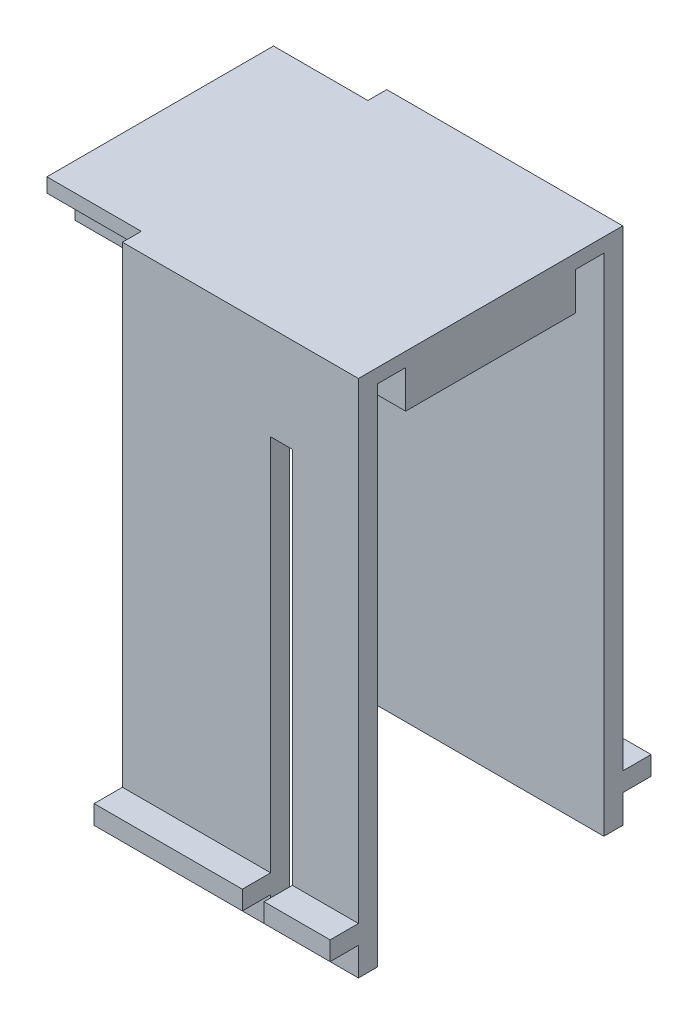
ISO-10303-21;
HEADER;
FILE_DESCRIPTION(('STEP AP214'),'2;1');
FILE_NAME('part.step','',(''),(''),'','','');
FILE_SCHEMA(('AUTOMOTIVE_DESIGN { 1 0 10303 214 1 1 1 1 }'));
ENDSEC;
DATA;
#1=APPLICATION_CONTEXT('core data for automotive mechanical design processes');
#2=APPLICATION_PROTOCOL_DEFINITION('international standard','automotive_design',2000,#1);
#3=PRODUCT_CONTEXT('',#1,'mechanical');
#4=PRODUCT('Part','Part','',(#3));
#5=PRODUCT_RELATED_PRODUCT_CATEGORY('part','',(#4));
#6=PRODUCT_DEFINITION_FORMATION('','',#4);
#7=PRODUCT_DEFINITION_CONTEXT('part definition',#1,'design');
#8=PRODUCT_DEFINITION('design','',#6,#7);
#9=PRODUCT_DEFINITION_SHAPE('','',#8);
#10=(LENGTH_UNIT() NAMED_UNIT(*) SI_UNIT(.MILLI.,.METRE.));
#11=(NAMED_UNIT(*) PLANE_ANGLE_UNIT() SI_UNIT($,.RADIAN.));
#12=(NAMED_UNIT(*) SI_UNIT($,.STERADIAN.) SOLID_ANGLE_UNIT());
#13=UNCERTAINTY_MEASURE_WITH_UNIT(LENGTH_MEASURE(1.E-05),#10,'distance_accuracy_value','');
#14=(GEOMETRIC_REPRESENTATION_CONTEXT(3) GLOBAL_UNCERTAINTY_ASSIGNED_CONTEXT((#13)) GLOBAL_UNIT_ASSIGNED_CONTEXT((#10,
#11,#12)) REPRESENTATION_CONTEXT('',''));
#15=CARTESIAN_POINT('',(0.,0.,0.));
#16=DIRECTION('',(0.,0.,1.));
#17=DIRECTION('',(1.,0.,0.));
#18=AXIS2_PLACEMENT_3D('',#15,#16,#17);
#19=CARTESIAN_POINT('',(0.,0.,-26.));
#20=DIRECTION('',(0.,0.,-1.));
#21=DIRECTION('',(-1.,0.,0.));
#22=AXIS2_PLACEMENT_3D('',#19,#20,#21);
#23=PLANE('',#22);
#24=DIRECTION('',(1.,0.,0.));
#25=VECTOR('',#24,1.);
#26=CARTESIAN_POINT('',(12.5,-22.5,-26.));
#27=LINE('',#26,#25);
#28=CARTESIAN_POINT('',(-12.5,-22.5,-26.));
#29=VERTEX_POINT('',#28);
#30=CARTESIAN_POINT('',(12.5,-22.5,-26.));
#31=VERTEX_POINT('',#30);
#32=EDGE_CURVE('E63',#29,#31,#27,.T.);
#33=ORIENTED_EDGE('',*,*,#32,.F.);
#34=DIRECTION('',(0.,1.,0.));
#35=VECTOR('',#34,1.);
#36=CARTESIAN_POINT('',(-12.5,27.5,-26.));
#37=LINE('',#36,#35);
#38=CARTESIAN_POINT('',(-12.5,27.5,-26.));
#39=VERTEX_POINT('',#38);
#40=EDGE_CURVE('E430',#29,#39,#37,.T.);
#41=ORIENTED_EDGE('',*,*,#40,.T.);
#42=DIRECTION('',(1.,0.,0.));
#43=VECTOR('',#42,1.);
#44=CARTESIAN_POINT('',(12.5,27.5,-26.));
#45=LINE('',#44,#43);
#46=CARTESIAN_POINT('',(12.5,27.5,-26.));
#47=VERTEX_POINT('',#46);
#48=EDGE_CURVE('E434',#39,#47,#45,.T.);
#49=ORIENTED_EDGE('',*,*,#48,.T.);
#50=DIRECTION('',(0.,-1.,0.));
#51=VECTOR('',#50,1.);
#52=CARTESIAN_POINT('',(12.5,27.5,-26.));
#53=LINE('',#52,#51);
#54=EDGE_CURVE('E424',#47,#31,#53,.T.);
#55=ORIENTED_EDGE('',*,*,#54,.T.);
#56=EDGE_LOOP('',(#33,#41,#49,#55));
#57=FACE_BOUND('',#56,.T.);
#58=ADVANCED_FACE('F45',(#57),#23,.T.);
#59=CARTESIAN_POINT('',(0.,0.,2.));
#60=DIRECTION('',(0.,0.,1.));
#61=DIRECTION('',(1.,0.,0.));
#62=AXIS2_PLACEMENT_3D('',#59,#60,#61);
#63=PLANE('',#62);
#64=DIRECTION('',(0.,1.,0.));
#65=VECTOR('',#64,1.);
#66=CARTESIAN_POINT('',(12.5,27.5,2.));
#67=LINE('',#66,#65);
#68=CARTESIAN_POINT('',(12.5,-27.5,2.));
#69=VERTEX_POINT('',#68);
#70=CARTESIAN_POINT('',(12.5,-24.5,2.));
#71=VERTEX_POINT('',#70);
#72=EDGE_CURVE('E495',#69,#71,#67,.T.);
#73=ORIENTED_EDGE('',*,*,#72,.T.);
#74=DIRECTION('',(1.,0.,0.));
#75=VECTOR('',#74,1.);
#76=CARTESIAN_POINT('',(5.50000000000001,-24.5,2.));
#77=LINE('',#76,#75);
#78=CARTESIAN_POINT('',(5.50000000000001,-24.5,2.));
#79=VERTEX_POINT('',#78);
#80=EDGE_CURVE('E301',#79,#71,#77,.T.);
#81=ORIENTED_EDGE('',*,*,#80,.F.);
#82=DIRECTION('',(0.,1.,0.));
#83=VECTOR('',#82,1.);
#84=CARTESIAN_POINT('',(5.50000000000001,-27.5,2.));
#85=LINE('',#84,#83);
#86=CARTESIAN_POINT('',(5.50000000000001,-27.5,2.));
#87=VERTEX_POINT('',#86);
#88=EDGE_CURVE('E362',#87,#79,#85,.T.);
#89=ORIENTED_EDGE('',*,*,#88,.F.);
#90=DIRECTION('',(1.,0.,0.));
#91=VECTOR('',#90,1.);
#92=CARTESIAN_POINT('',(-12.5,-27.5,2.));
#93=LINE('',#92,#91);
#94=EDGE_CURVE('E507',#87,#69,#93,.T.);
#95=ORIENTED_EDGE('',*,*,#94,.T.);
#96=EDGE_LOOP('',(#73,#81,#89,#95));
#97=FACE_BOUND('',#96,.T.);
#98=ADVANCED_FACE('F573',(#97),#63,.T.);
#99=CARTESIAN_POINT('',(5.50000000000001,-22.5,2.));
#100=VERTEX_POINT('',#99);
#101=CARTESIAN_POINT('',(5.50000000000001,17.5,2.));
#102=VERTEX_POINT('',#101);
#103=EDGE_CURVE('E353',#100,#102,#85,.T.);
#104=ORIENTED_EDGE('',*,*,#103,.F.);
#105=DIRECTION('',(-1.,0.,0.));
#106=VECTOR('',#105,1.);
#107=CARTESIAN_POINT('',(5.50000000000001,-22.5,2.));
#108=LINE('',#107,#106);
#109=CARTESIAN_POINT('',(12.5,-22.5,2.));
#110=VERTEX_POINT('',#109);
#111=EDGE_CURVE('E297',#110,#100,#108,.T.);
#112=ORIENTED_EDGE('',*,*,#111,.F.);
#113=CARTESIAN_POINT('',(12.5,27.5,2.));
#114=VERTEX_POINT('',#113);
#115=EDGE_CURVE('E500',#110,#114,#67,.T.);
#116=ORIENTED_EDGE('',*,*,#115,.T.);
#117=DIRECTION('',(-1.,0.,0.));
#118=VECTOR('',#117,1.);
#119=CARTESIAN_POINT('',(-12.5,27.5,2.));
#120=LINE('',#119,#118);
#121=CARTESIAN_POINT('',(-12.5,27.5,2.));
#122=VERTEX_POINT('',#121);
#123=EDGE_CURVE('E499',#114,#122,#120,.T.);
#124=ORIENTED_EDGE('',*,*,#123,.T.);
#125=DIRECTION('',(0.,-1.,0.));
#126=VECTOR('',#125,1.);
#127=CARTESIAN_POINT('',(-12.5,27.5,2.));
#128=LINE('',#127,#126);
#129=CARTESIAN_POINT('',(-12.5,-22.5,2.));
#130=VERTEX_POINT('',#129);
#131=EDGE_CURVE('E504',#122,#130,#128,.T.);
#132=ORIENTED_EDGE('',*,*,#131,.T.);
#133=DIRECTION('',(-1.,0.,0.));
#134=VECTOR('',#133,1.);
#135=CARTESIAN_POINT('',(-12.5,-22.5,2.));
#136=LINE('',#135,#134);
#137=CARTESIAN_POINT('',(3.20000000000001,-22.5,2.));
#138=VERTEX_POINT('',#137);
#139=EDGE_CURVE('E322',#138,#130,#136,.T.);
#140=ORIENTED_EDGE('',*,*,#139,.F.);
#141=DIRECTION('',(0.,-1.,0.));
#142=VECTOR('',#141,1.);
#143=CARTESIAN_POINT('',(3.20000000000001,-27.5,2.));
#144=LINE('',#143,#142);
#145=CARTESIAN_POINT('',(3.20000000000001,17.5,2.));
#146=VERTEX_POINT('',#145);
#147=EDGE_CURVE('E371',#146,#138,#144,.T.);
#148=ORIENTED_EDGE('',*,*,#147,.F.);
#149=DIRECTION('',(-1.,0.,0.));
#150=VECTOR('',#149,1.);
#151=CARTESIAN_POINT('',(5.50000000000001,17.5,2.));
#152=LINE('',#151,#150);
#153=EDGE_CURVE('E366',#102,#146,#152,.T.);
#154=ORIENTED_EDGE('',*,*,#153,.F.);
#155=EDGE_LOOP('',(#104,#112,#116,#124,#132,#140,#148,#154));
#156=FACE_BOUND('',#155,.T.);
#157=ADVANCED_FACE('F581',(#156),#63,.T.);
#158=CARTESIAN_POINT('',(-12.5,-27.5,2.));
#159=DIRECTION('',(0.,1.,0.));
#160=DIRECTION('',(0.,0.,1.));
#161=AXIS2_PLACEMENT_3D('',#158,#159,#160);
#162=PLANE('',#161);
#163=ORIENTED_EDGE('',*,*,#94,.F.);
#164=DIRECTION('',(0.,0.,1.));
#165=VECTOR('',#164,1.);
#166=CARTESIAN_POINT('',(5.50000000000001,-27.5,-45.0587394408676));
#167=LINE('',#166,#165);
#168=CARTESIAN_POINT('',(5.50000000000001,-27.5,0.));
#169=VERTEX_POINT('',#168);
#170=EDGE_CURVE('E358',#169,#87,#167,.T.);
#171=ORIENTED_EDGE('',*,*,#170,.F.);
#172=DIRECTION('',(1.,0.,0.));
#173=VECTOR('',#172,1.);
#174=CARTESIAN_POINT('',(-12.5,-27.5,0.));
#175=LINE('',#174,#173);
#176=CARTESIAN_POINT('',(12.5,-27.5,0.));
#177=VERTEX_POINT('',#176);
#178=EDGE_CURVE('E519',#169,#177,#175,.T.);
#179=ORIENTED_EDGE('',*,*,#178,.T.);
#180=DIRECTION('',(0.,0.,-1.));
#181=VECTOR('',#180,1.);
#182=CARTESIAN_POINT('',(12.5,-27.5,2.));
#183=LINE('',#182,#181);
#184=EDGE_CURVE('E512',#69,#177,#183,.T.);
#185=ORIENTED_EDGE('',*,*,#184,.F.);
#186=EDGE_LOOP('',(#163,#171,#179,#185));
#187=FACE_BOUND('',#186,.T.);
#188=ADVANCED_FACE('F619',(#187),#162,.F.);
#189=CARTESIAN_POINT('',(12.5,26.,-24.));
#190=DIRECTION('',(0.,1.,0.));
#191=DIRECTION('',(0.,0.,1.));
#192=AXIS2_PLACEMENT_3D('',#189,#190,#191);
#193=PLANE('',#192);
#194=DIRECTION('',(1.,0.,0.));
#195=VECTOR('',#194,1.);
#196=CARTESIAN_POINT('',(-22.5,26.,-21.));
#197=LINE('',#196,#195);
#198=CARTESIAN_POINT('',(-22.5,26.,-21.));
#199=VERTEX_POINT('',#198);
#200=CARTESIAN_POINT('',(12.5,26.,-21.));
#201=VERTEX_POINT('',#200);
#202=EDGE_CURVE('E390',#199,#201,#197,.T.);
#203=ORIENTED_EDGE('',*,*,#202,.F.);
#204=DIRECTION('',(0.,0.,1.));
#205=VECTOR('',#204,1.);
#206=CARTESIAN_POINT('',(-22.5,26.,-24.));
#207=LINE('',#206,#205);
#208=CARTESIAN_POINT('',(-22.5,26.,-24.));
#209=VERTEX_POINT('',#208);
#210=EDGE_CURVE('E485',#209,#199,#207,.T.);
#211=ORIENTED_EDGE('',*,*,#210,.F.);
#212=DIRECTION('',(-1.,0.,0.));
#213=VECTOR('',#212,1.);
#214=CARTESIAN_POINT('',(12.5,26.,-24.));
#215=LINE('',#214,#213);
#216=CARTESIAN_POINT('',(-12.5,26.,-24.));
#217=VERTEX_POINT('',#216);
#218=EDGE_CURVE('E463',#217,#209,#215,.T.);
#219=ORIENTED_EDGE('',*,*,#218,.F.);
#220=CARTESIAN_POINT('',(12.5,26.,-24.));
#221=VERTEX_POINT('',#220);
#222=EDGE_CURVE('E458',#221,#217,#215,.T.);
#223=ORIENTED_EDGE('',*,*,#222,.F.);
#224=DIRECTION('',(0.,0.,1.));
#225=VECTOR('',#224,1.);
#226=CARTESIAN_POINT('',(12.5,26.,-24.));
#227=LINE('',#226,#225);
#228=EDGE_CURVE('E490',#221,#201,#227,.T.);
#229=ORIENTED_EDGE('',*,*,#228,.T.);
#230=EDGE_LOOP('',(#203,#211,#219,#223,#229));
#231=FACE_BOUND('',#230,.T.);
#232=ADVANCED_FACE('F616',(#231),#193,.F.);
#233=DIRECTION('',(-1.,0.,0.));
#234=VECTOR('',#233,1.);
#235=CARTESIAN_POINT('',(-22.5,26.,-3.));
#236=LINE('',#235,#234);
#237=CARTESIAN_POINT('',(12.5,26.,-3.));
#238=VERTEX_POINT('',#237);
#239=CARTESIAN_POINT('',(-22.5,26.,-3.));
#240=VERTEX_POINT('',#239);
#241=EDGE_CURVE('E396',#238,#240,#236,.T.);
#242=ORIENTED_EDGE('',*,*,#241,.F.);
#243=CARTESIAN_POINT('',(12.5,26.,0.));
#244=VERTEX_POINT('',#243);
#245=EDGE_CURVE('E489',#238,#244,#227,.T.);
#246=ORIENTED_EDGE('',*,*,#245,.T.);
#247=DIRECTION('',(-1.,0.,0.));
#248=VECTOR('',#247,1.);
#249=CARTESIAN_POINT('',(12.5,26.,0.));
#250=LINE('',#249,#248);
#251=CARTESIAN_POINT('',(-12.5,26.,0.));
#252=VERTEX_POINT('',#251);
#253=EDGE_CURVE('E470',#244,#252,#250,.T.);
#254=ORIENTED_EDGE('',*,*,#253,.T.);
#255=CARTESIAN_POINT('',(-22.5,26.,0.));
#256=VERTEX_POINT('',#255);
#257=EDGE_CURVE('E457',#252,#256,#250,.T.);
#258=ORIENTED_EDGE('',*,*,#257,.T.);
#259=EDGE_CURVE('E484',#240,#256,#207,.T.);
#260=ORIENTED_EDGE('',*,*,#259,.F.);
#261=EDGE_LOOP('',(#242,#246,#254,#258,#260));
#262=FACE_BOUND('',#261,.T.);
#263=ADVANCED_FACE('F618',(#262),#193,.F.);
#264=CARTESIAN_POINT('',(0.,0.,0.));
#265=DIRECTION('',(0.,0.,1.));
#266=DIRECTION('',(1.,0.,0.));
#267=AXIS2_PLACEMENT_3D('',#264,#265,#266);
#268=PLANE('',#267);
#269=ORIENTED_EDGE('',*,*,#178,.F.);
#270=DIRECTION('',(0.,-1.,0.));
#271=VECTOR('',#270,1.);
#272=CARTESIAN_POINT('',(5.50000000000001,-27.5,0.));
#273=LINE('',#272,#271);
#274=CARTESIAN_POINT('',(5.50000000000001,17.5,0.));
#275=VERTEX_POINT('',#274);
#276=EDGE_CURVE('E357',#275,#169,#273,.T.);
#277=ORIENTED_EDGE('',*,*,#276,.F.);
#278=DIRECTION('',(1.,0.,0.));
#279=VECTOR('',#278,1.);
#280=CARTESIAN_POINT('',(5.50000000000001,17.5,0.));
#281=LINE('',#280,#279);
#282=CARTESIAN_POINT('',(3.20000000000001,17.5,0.));
#283=VERTEX_POINT('',#282);
#284=EDGE_CURVE('E361',#283,#275,#281,.T.);
#285=ORIENTED_EDGE('',*,*,#284,.F.);
#286=DIRECTION('',(0.,1.,0.));
#287=VECTOR('',#286,1.);
#288=CARTESIAN_POINT('',(3.20000000000001,-27.5,0.));
#289=LINE('',#288,#287);
#290=CARTESIAN_POINT('',(3.20000000000001,-27.5,0.));
#291=VERTEX_POINT('',#290);
#292=EDGE_CURVE('E354',#291,#283,#289,.T.);
#293=ORIENTED_EDGE('',*,*,#292,.F.);
#294=CARTESIAN_POINT('',(-12.5,-27.5,0.));
#295=VERTEX_POINT('',#294);
#296=EDGE_CURVE('E520',#295,#291,#175,.T.);
#297=ORIENTED_EDGE('',*,*,#296,.F.);
#298=DIRECTION('',(0.,-1.,0.));
#299=VECTOR('',#298,1.);
#300=CARTESIAN_POINT('',(-12.5,27.5,0.));
#301=LINE('',#300,#299);
#302=EDGE_CURVE('E515',#252,#295,#301,.T.);
#303=ORIENTED_EDGE('',*,*,#302,.F.);
#304=ORIENTED_EDGE('',*,*,#253,.F.);
#305=DIRECTION('',(0.,1.,0.));
#306=VECTOR('',#305,1.);
#307=CARTESIAN_POINT('',(12.5,27.5,0.));
#308=LINE('',#307,#306);
#309=EDGE_CURVE('E494',#177,#244,#308,.T.);
#310=ORIENTED_EDGE('',*,*,#309,.F.);
#311=EDGE_LOOP('',(#269,#277,#285,#293,#297,#303,#304,#310));
#312=FACE_BOUND('',#311,.T.);
#313=ADVANCED_FACE('F625',(#312),#268,.F.);
#314=CARTESIAN_POINT('',(12.5,27.5,2.));
#315=DIRECTION('',(-1.,0.,0.));
#316=DIRECTION('',(0.,-1.,0.));
#317=AXIS2_PLACEMENT_3D('',#314,#315,#316);
#318=PLANE('',#317);
#319=ORIENTED_EDGE('',*,*,#309,.T.);
#320=ORIENTED_EDGE('',*,*,#245,.F.);
#321=DIRECTION('',(0.,1.,0.));
#322=VECTOR('',#321,1.);
#323=CARTESIAN_POINT('',(12.5,22.,-3.));
#324=LINE('',#323,#322);
#325=CARTESIAN_POINT('',(12.5,22.,-3.));
#326=VERTEX_POINT('',#325);
#327=EDGE_CURVE('E413',#326,#238,#324,.T.);
#328=ORIENTED_EDGE('',*,*,#327,.F.);
#329=DIRECTION('',(0.,0.,1.));
#330=VECTOR('',#329,1.);
#331=CARTESIAN_POINT('',(12.5,22.,-3.));
#332=LINE('',#331,#330);
#333=CARTESIAN_POINT('',(12.5,22.,-21.));
#334=VERTEX_POINT('',#333);
#335=EDGE_CURVE('E399',#334,#326,#332,.T.);
#336=ORIENTED_EDGE('',*,*,#335,.F.);
#337=DIRECTION('',(0.,1.,0.));
#338=VECTOR('',#337,1.);
#339=CARTESIAN_POINT('',(12.5,22.,-21.));
#340=LINE('',#339,#338);
#341=EDGE_CURVE('E416',#334,#201,#340,.T.);
#342=ORIENTED_EDGE('',*,*,#341,.T.);
#343=ORIENTED_EDGE('',*,*,#228,.F.);
#344=DIRECTION('',(0.,-1.,0.));
#345=VECTOR('',#344,1.);
#346=CARTESIAN_POINT('',(12.5,27.5,-24.));
#347=LINE('',#346,#345);
#348=CARTESIAN_POINT('',(12.5,-27.5,-24.));
#349=VERTEX_POINT('',#348);
#350=EDGE_CURVE('E423',#221,#349,#347,.T.);
#351=ORIENTED_EDGE('',*,*,#350,.T.);
#352=DIRECTION('',(0.,0.,1.));
#353=VECTOR('',#352,1.);
#354=CARTESIAN_POINT('',(12.5,-27.5,-26.));
#355=LINE('',#354,#353);
#356=CARTESIAN_POINT('',(12.5,-27.5,-26.));
#357=VERTEX_POINT('',#356);
#358=EDGE_CURVE('E453',#357,#349,#355,.T.);
#359=ORIENTED_EDGE('',*,*,#358,.F.);
#360=CARTESIAN_POINT('',(12.5,-24.5,-26.));
#361=VERTEX_POINT('',#360);
#362=EDGE_CURVE('E275',#361,#357,#53,.T.);
#363=ORIENTED_EDGE('',*,*,#362,.F.);
#364=DIRECTION('',(0.,0.,1.));
#365=VECTOR('',#364,1.);
#366=CARTESIAN_POINT('',(12.5,-24.5,-29.));
#367=LINE('',#366,#365);
#368=CARTESIAN_POINT('',(12.5,-24.5,-29.));
#369=VERTEX_POINT('',#368);
#370=EDGE_CURVE('E255',#369,#361,#367,.T.);
#371=ORIENTED_EDGE('',*,*,#370,.F.);
#372=DIRECTION('',(0.,-1.,0.));
#373=VECTOR('',#372,1.);
#374=CARTESIAN_POINT('',(12.5,-22.5,-29.));
#375=LINE('',#374,#373);
#376=CARTESIAN_POINT('',(12.5,-22.5,-29.));
#377=VERTEX_POINT('',#376);
#378=EDGE_CURVE('E262',#377,#369,#375,.T.);
#379=ORIENTED_EDGE('',*,*,#378,.F.);
#380=DIRECTION('',(0.,0.,1.));
#381=VECTOR('',#380,1.);
#382=CARTESIAN_POINT('',(12.5,-22.5,-29.));
#383=LINE('',#382,#381);
#384=EDGE_CURVE('E545',#377,#31,#383,.T.);
#385=ORIENTED_EDGE('',*,*,#384,.T.);
#386=ORIENTED_EDGE('',*,*,#54,.F.);
#387=DIRECTION('',(0.,0.,-1.));
#388=VECTOR('',#387,1.);
#389=CARTESIAN_POINT('',(12.5,27.5,2.));
#390=LINE('',#389,#388);
#391=EDGE_CURVE('E49',#114,#47,#390,.T.);
#392=ORIENTED_EDGE('',*,*,#391,.F.);
#393=ORIENTED_EDGE('',*,*,#115,.F.);
#394=DIRECTION('',(0.,0.,-1.));
#395=VECTOR('',#394,1.);
#396=CARTESIAN_POINT('',(12.5,-22.5,5.));
#397=LINE('',#396,#395);
#398=CARTESIAN_POINT('',(12.5,-22.5,5.));
#399=VERTEX_POINT('',#398);
#400=EDGE_CURVE('E290',#399,#110,#397,.T.);
#401=ORIENTED_EDGE('',*,*,#400,.F.);
#402=DIRECTION('',(0.,1.,0.));
#403=VECTOR('',#402,1.);
#404=CARTESIAN_POINT('',(12.5,-22.5,5.));
#405=LINE('',#404,#403);
#406=CARTESIAN_POINT('',(12.5,-24.5,5.));
#407=VERTEX_POINT('',#406);
#408=EDGE_CURVE('E308',#407,#399,#405,.T.);
#409=ORIENTED_EDGE('',*,*,#408,.F.);
#410=DIRECTION('',(0.,0.,-1.));
#411=VECTOR('',#410,1.);
#412=CARTESIAN_POINT('',(12.5,-24.5,5.));
#413=LINE('',#412,#411);
#414=EDGE_CURVE('E281',#407,#71,#413,.T.);
#415=ORIENTED_EDGE('',*,*,#414,.T.);
#416=ORIENTED_EDGE('',*,*,#72,.F.);
#417=ORIENTED_EDGE('',*,*,#184,.T.);
#418=EDGE_LOOP('',(#319,#320,#328,#336,#342,#343,#351,#359,#363,#371,#379,#385,#386,#392,#393,
#401,#409,#415,#416,#417));
#419=FACE_BOUND('',#418,.T.);
#420=ADVANCED_FACE('F47',(#419),#318,.F.);
#421=CARTESIAN_POINT('',(-12.5,27.5,2.));
#422=DIRECTION('',(0.,-1.,0.));
#423=DIRECTION('',(0.,0.,-1.));
#424=AXIS2_PLACEMENT_3D('',#421,#422,#423);
#425=PLANE('',#424);
#426=ORIENTED_EDGE('',*,*,#391,.T.);
#427=ORIENTED_EDGE('',*,*,#48,.F.);
#428=DIRECTION('',(0.,0.,1.));
#429=VECTOR('',#428,1.);
#430=CARTESIAN_POINT('',(-12.5,27.5,-26.));
#431=LINE('',#430,#429);
#432=CARTESIAN_POINT('',(-12.5,27.5,-24.));
#433=VERTEX_POINT('',#432);
#434=EDGE_CURVE('E438',#39,#433,#431,.T.);
#435=ORIENTED_EDGE('',*,*,#434,.T.);
#436=DIRECTION('',(1.,0.,0.));
#437=VECTOR('',#436,1.);
#438=CARTESIAN_POINT('',(12.5,27.5,-24.));
#439=LINE('',#438,#437);
#440=CARTESIAN_POINT('',(-22.5,27.5,-24.));
#441=VERTEX_POINT('',#440);
#442=EDGE_CURVE('E466',#441,#433,#439,.T.);
#443=ORIENTED_EDGE('',*,*,#442,.F.);
#444=DIRECTION('',(0.,0.,1.));
#445=VECTOR('',#444,1.);
#446=CARTESIAN_POINT('',(-22.5,27.5,-24.));
#447=LINE('',#446,#445);
#448=CARTESIAN_POINT('',(-22.5,27.5,0.));
#449=VERTEX_POINT('',#448);
#450=EDGE_CURVE('E469',#441,#449,#447,.T.);
#451=ORIENTED_EDGE('',*,*,#450,.T.);
#452=DIRECTION('',(1.,0.,0.));
#453=VECTOR('',#452,1.);
#454=CARTESIAN_POINT('',(12.5,27.5,0.));
#455=LINE('',#454,#453);
#456=CARTESIAN_POINT('',(-12.5,27.5,0.));
#457=VERTEX_POINT('',#456);
#458=EDGE_CURVE('E477',#449,#457,#455,.T.);
#459=ORIENTED_EDGE('',*,*,#458,.T.);
#460=DIRECTION('',(0.,0.,-1.));
#461=VECTOR('',#460,1.);
#462=CARTESIAN_POINT('',(-12.5,27.5,2.));
#463=LINE('',#462,#461);
#464=EDGE_CURVE('E530',#122,#457,#463,.T.);
#465=ORIENTED_EDGE('',*,*,#464,.F.);
#466=ORIENTED_EDGE('',*,*,#123,.F.);
#467=EDGE_LOOP('',(#426,#427,#435,#443,#451,#459,#465,#466));
#468=FACE_BOUND('',#467,.T.);
#469=ADVANCED_FACE('F541',(#468),#425,.F.);
#470=CARTESIAN_POINT('',(-12.5,27.5,2.));
#471=DIRECTION('',(1.,0.,0.));
#472=DIRECTION('',(0.,1.,0.));
#473=AXIS2_PLACEMENT_3D('',#470,#471,#472);
#474=PLANE('',#473);
#475=EDGE_CURVE('E516',#457,#252,#301,.T.);
#476=ORIENTED_EDGE('',*,*,#475,.T.);
#477=ORIENTED_EDGE('',*,*,#302,.T.);
#478=DIRECTION('',(0.,0.,-1.));
#479=VECTOR('',#478,1.);
#480=CARTESIAN_POINT('',(-12.5,-27.5,2.));
#481=LINE('',#480,#479);
#482=CARTESIAN_POINT('',(-12.5,-27.5,2.));
#483=VERTEX_POINT('',#482);
#484=EDGE_CURVE('E527',#483,#295,#481,.T.);
#485=ORIENTED_EDGE('',*,*,#484,.F.);
#486=CARTESIAN_POINT('',(-12.5,-24.5,2.));
#487=VERTEX_POINT('',#486);
#488=EDGE_CURVE('E503',#487,#483,#128,.T.);
#489=ORIENTED_EDGE('',*,*,#488,.F.);
#490=DIRECTION('',(0.,0.,-1.));
#491=VECTOR('',#490,1.);
#492=CARTESIAN_POINT('',(-12.5,-24.5,5.));
#493=LINE('',#492,#491);
#494=CARTESIAN_POINT('',(-12.5,-24.5,5.));
#495=VERTEX_POINT('',#494);
#496=EDGE_CURVE('E349',#495,#487,#493,.T.);
#497=ORIENTED_EDGE('',*,*,#496,.F.);
#498=DIRECTION('',(0.,-1.,0.));
#499=VECTOR('',#498,1.);
#500=CARTESIAN_POINT('',(-12.5,-22.5,5.));
#501=LINE('',#500,#499);
#502=CARTESIAN_POINT('',(-12.5,-22.5,5.));
#503=VERTEX_POINT('',#502);
#504=EDGE_CURVE('E317',#503,#495,#501,.T.);
#505=ORIENTED_EDGE('',*,*,#504,.F.);
#506=DIRECTION('',(0.,0.,-1.));
#507=VECTOR('',#506,1.);
#508=CARTESIAN_POINT('',(-12.5,-22.5,5.));
#509=LINE('',#508,#507);
#510=EDGE_CURVE('E331',#503,#130,#509,.T.);
#511=ORIENTED_EDGE('',*,*,#510,.T.);
#512=ORIENTED_EDGE('',*,*,#131,.F.);
#513=ORIENTED_EDGE('',*,*,#464,.T.);
#514=EDGE_LOOP('',(#476,#477,#485,#489,#497,#505,#511,#512,#513));
#515=FACE_BOUND('',#514,.T.);
#516=ADVANCED_FACE('F631',(#515),#474,.F.);
#517=ORIENTED_EDGE('',*,*,#296,.T.);
#518=DIRECTION('',(0.,0.,1.));
#519=VECTOR('',#518,1.);
#520=CARTESIAN_POINT('',(3.20000000000001,-27.5,-45.0587394408676));
#521=LINE('',#520,#519);
#522=CARTESIAN_POINT('',(3.20000000000001,-27.5,2.));
#523=VERTEX_POINT('',#522);
#524=EDGE_CURVE('E378',#291,#523,#521,.T.);
#525=ORIENTED_EDGE('',*,*,#524,.T.);
#526=EDGE_CURVE('E508',#483,#523,#93,.T.);
#527=ORIENTED_EDGE('',*,*,#526,.F.);
#528=ORIENTED_EDGE('',*,*,#484,.T.);
#529=EDGE_LOOP('',(#517,#525,#527,#528));
#530=FACE_BOUND('',#529,.T.);
#531=ADVANCED_FACE('F623',(#530),#162,.F.);
#532=DIRECTION('',(1.,0.,0.));
#533=VECTOR('',#532,1.);
#534=CARTESIAN_POINT('',(-12.5,-24.5,2.));
#535=LINE('',#534,#533);
#536=CARTESIAN_POINT('',(3.20000000000001,-24.5,2.));
#537=VERTEX_POINT('',#536);
#538=EDGE_CURVE('E305',#487,#537,#535,.T.);
#539=ORIENTED_EDGE('',*,*,#538,.F.);
#540=ORIENTED_EDGE('',*,*,#488,.T.);
#541=ORIENTED_EDGE('',*,*,#526,.T.);
#542=EDGE_CURVE('E370',#537,#523,#144,.T.);
#543=ORIENTED_EDGE('',*,*,#542,.F.);
#544=EDGE_LOOP('',(#539,#540,#541,#543));
#545=FACE_BOUND('',#544,.T.);
#546=ADVANCED_FACE('F584',(#545),#63,.T.);
#547=CARTESIAN_POINT('',(-22.5,27.5,-24.));
#548=DIRECTION('',(1.,0.,0.));
#549=DIRECTION('',(0.,1.,0.));
#550=AXIS2_PLACEMENT_3D('',#547,#548,#549);
#551=PLANE('',#550);
#552=DIRECTION('',(0.,1.,0.));
#553=VECTOR('',#552,1.);
#554=CARTESIAN_POINT('',(-22.5,27.5,0.));
#555=LINE('',#554,#553);
#556=EDGE_CURVE('E474',#256,#449,#555,.T.);
#557=ORIENTED_EDGE('',*,*,#556,.T.);
#558=ORIENTED_EDGE('',*,*,#450,.F.);
#559=DIRECTION('',(0.,1.,0.));
#560=VECTOR('',#559,1.);
#561=CARTESIAN_POINT('',(-22.5,27.5,-24.));
#562=LINE('',#561,#560);
#563=EDGE_CURVE('E462',#209,#441,#562,.T.);
#564=ORIENTED_EDGE('',*,*,#563,.F.);
#565=ORIENTED_EDGE('',*,*,#210,.T.);
#566=DIRECTION('',(0.,1.,0.));
#567=VECTOR('',#566,1.);
#568=CARTESIAN_POINT('',(-22.5,22.,-21.));
#569=LINE('',#568,#567);
#570=CARTESIAN_POINT('',(-22.5,22.,-21.));
#571=VERTEX_POINT('',#570);
#572=EDGE_CURVE('E420',#571,#199,#569,.T.);
#573=ORIENTED_EDGE('',*,*,#572,.F.);
#574=DIRECTION('',(0.,0.,-1.));
#575=VECTOR('',#574,1.);
#576=CARTESIAN_POINT('',(-22.5,22.,-3.));
#577=LINE('',#576,#575);
#578=CARTESIAN_POINT('',(-22.5,22.,-3.));
#579=VERTEX_POINT('',#578);
#580=EDGE_CURVE('E391',#579,#571,#577,.T.);
#581=ORIENTED_EDGE('',*,*,#580,.F.);
#582=DIRECTION('',(0.,1.,0.));
#583=VECTOR('',#582,1.);
#584=CARTESIAN_POINT('',(-22.5,22.,-3.));
#585=LINE('',#584,#583);
#586=EDGE_CURVE('E405',#579,#240,#585,.T.);
#587=ORIENTED_EDGE('',*,*,#586,.T.);
#588=ORIENTED_EDGE('',*,*,#259,.T.);
#589=EDGE_LOOP('',(#557,#558,#564,#565,#573,#581,#587,#588));
#590=FACE_BOUND('',#589,.T.);
#591=ADVANCED_FACE('F608',(#590),#551,.F.);
#592=CARTESIAN_POINT('',(0.,0.,-24.));
#593=DIRECTION('',(0.,0.,-1.));
#594=DIRECTION('',(-1.,0.,0.));
#595=AXIS2_PLACEMENT_3D('',#592,#593,#594);
#596=PLANE('',#595);
#597=DIRECTION('',(0.,1.,0.));
#598=VECTOR('',#597,1.);
#599=CARTESIAN_POINT('',(-12.5,27.5,-24.));
#600=LINE('',#599,#598);
#601=EDGE_CURVE('E11',#217,#433,#600,.T.);
#602=ORIENTED_EDGE('',*,*,#601,.F.);
#603=ORIENTED_EDGE('',*,*,#218,.T.);
#604=ORIENTED_EDGE('',*,*,#563,.T.);
#605=ORIENTED_EDGE('',*,*,#442,.T.);
#606=EDGE_LOOP('',(#602,#603,#604,#605));
#607=FACE_BOUND('',#606,.T.);
#608=ADVANCED_FACE('F604',(#607),#596,.T.);
#609=CARTESIAN_POINT('',(0.,0.,0.));
#610=DIRECTION('',(0.,0.,-1.));
#611=DIRECTION('',(-1.,0.,0.));
#612=AXIS2_PLACEMENT_3D('',#609,#610,#611);
#613=PLANE('',#612);
#614=ORIENTED_EDGE('',*,*,#475,.F.);
#615=ORIENTED_EDGE('',*,*,#458,.F.);
#616=ORIENTED_EDGE('',*,*,#556,.F.);
#617=ORIENTED_EDGE('',*,*,#257,.F.);
#618=EDGE_LOOP('',(#614,#615,#616,#617));
#619=FACE_BOUND('',#618,.T.);
#620=ADVANCED_FACE('F607',(#619),#613,.F.);
#621=CARTESIAN_POINT('',(0.,0.,-24.));
#622=DIRECTION('',(0.,0.,-1.));
#623=DIRECTION('',(-1.,0.,0.));
#624=AXIS2_PLACEMENT_3D('',#621,#622,#623);
#625=PLANE('',#624);
#626=ORIENTED_EDGE('',*,*,#350,.F.);
#627=ORIENTED_EDGE('',*,*,#222,.T.);
#628=CARTESIAN_POINT('',(-12.5,-27.5,-24.));
#629=VERTEX_POINT('',#628);
#630=EDGE_CURVE('E56',#629,#217,#600,.T.);
#631=ORIENTED_EDGE('',*,*,#630,.F.);
#632=DIRECTION('',(-1.,0.,0.));
#633=VECTOR('',#632,1.);
#634=CARTESIAN_POINT('',(12.5,-27.5,-24.));
#635=LINE('',#634,#633);
#636=EDGE_CURVE('E441',#349,#629,#635,.T.);
#637=ORIENTED_EDGE('',*,*,#636,.F.);
#638=EDGE_LOOP('',(#626,#627,#631,#637));
#639=FACE_BOUND('',#638,.T.);
#640=ADVANCED_FACE('F600',(#639),#625,.F.);
#641=CARTESIAN_POINT('',(12.5,-27.5,-26.));
#642=DIRECTION('',(0.,1.,0.));
#643=DIRECTION('',(0.,0.,1.));
#644=AXIS2_PLACEMENT_3D('',#641,#642,#643);
#645=PLANE('',#644);
#646=ORIENTED_EDGE('',*,*,#636,.T.);
#647=DIRECTION('',(0.,0.,1.));
#648=VECTOR('',#647,1.);
#649=CARTESIAN_POINT('',(-12.5,-27.5,-26.));
#650=LINE('',#649,#648);
#651=CARTESIAN_POINT('',(-12.5,-27.5,-26.));
#652=VERTEX_POINT('',#651);
#653=EDGE_CURVE('E449',#652,#629,#650,.T.);
#654=ORIENTED_EDGE('',*,*,#653,.F.);
#655=DIRECTION('',(-1.,0.,0.));
#656=VECTOR('',#655,1.);
#657=CARTESIAN_POINT('',(12.5,-27.5,-26.));
#658=LINE('',#657,#656);
#659=EDGE_CURVE('E427',#357,#652,#658,.T.);
#660=ORIENTED_EDGE('',*,*,#659,.F.);
#661=ORIENTED_EDGE('',*,*,#358,.T.);
#662=EDGE_LOOP('',(#646,#654,#660,#661));
#663=FACE_BOUND('',#662,.T.);
#664=ADVANCED_FACE('F595',(#663),#645,.F.);
#665=CARTESIAN_POINT('',(-12.5,27.5,-26.));
#666=DIRECTION('',(1.,0.,0.));
#667=DIRECTION('',(0.,1.,0.));
#668=AXIS2_PLACEMENT_3D('',#665,#666,#667);
#669=PLANE('',#668);
#670=ORIENTED_EDGE('',*,*,#630,.T.);
#671=ORIENTED_EDGE('',*,*,#601,.T.);
#672=ORIENTED_EDGE('',*,*,#434,.F.);
#673=ORIENTED_EDGE('',*,*,#40,.F.);
#674=DIRECTION('',(0.,0.,1.));
#675=VECTOR('',#674,1.);
#676=CARTESIAN_POINT('',(-12.5,-22.5,-29.));
#677=LINE('',#676,#675);
#678=CARTESIAN_POINT('',(-12.5,-22.5,-29.));
#679=VERTEX_POINT('',#678);
#680=EDGE_CURVE('E283',#679,#29,#677,.T.);
#681=ORIENTED_EDGE('',*,*,#680,.F.);
#682=DIRECTION('',(0.,1.,0.));
#683=VECTOR('',#682,1.);
#684=CARTESIAN_POINT('',(-12.5,-22.5,-29.));
#685=LINE('',#684,#683);
#686=CARTESIAN_POINT('',(-12.5,-24.5,-29.));
#687=VERTEX_POINT('',#686);
#688=EDGE_CURVE('E261',#687,#679,#685,.T.);
#689=ORIENTED_EDGE('',*,*,#688,.F.);
#690=DIRECTION('',(0.,0.,1.));
#691=VECTOR('',#690,1.);
#692=CARTESIAN_POINT('',(-12.5,-24.5,-29.));
#693=LINE('',#692,#691);
#694=CARTESIAN_POINT('',(-12.5,-24.5,-26.));
#695=VERTEX_POINT('',#694);
#696=EDGE_CURVE('E257',#687,#695,#693,.T.);
#697=ORIENTED_EDGE('',*,*,#696,.T.);
#698=EDGE_CURVE('E431',#652,#695,#37,.T.);
#699=ORIENTED_EDGE('',*,*,#698,.F.);
#700=ORIENTED_EDGE('',*,*,#653,.T.);
#701=EDGE_LOOP('',(#670,#671,#672,#673,#681,#689,#697,#699,#700));
#702=FACE_BOUND('',#701,.T.);
#703=ADVANCED_FACE('F561',(#702),#669,.F.);
#704=DIRECTION('',(-1.,0.,0.));
#705=VECTOR('',#704,1.);
#706=CARTESIAN_POINT('',(12.5,-24.5,-26.));
#707=LINE('',#706,#705);
#708=EDGE_CURVE('E71',#361,#695,#707,.T.);
#709=ORIENTED_EDGE('',*,*,#708,.F.);
#710=ORIENTED_EDGE('',*,*,#362,.T.);
#711=ORIENTED_EDGE('',*,*,#659,.T.);
#712=ORIENTED_EDGE('',*,*,#698,.T.);
#713=EDGE_LOOP('',(#709,#710,#711,#712));
#714=FACE_BOUND('',#713,.T.);
#715=ADVANCED_FACE('F575',(#714),#23,.T.);
#716=CARTESIAN_POINT('',(-22.5,22.,-21.));
#717=DIRECTION('',(0.,0.,1.));
#718=DIRECTION('',(1.,0.,0.));
#719=AXIS2_PLACEMENT_3D('',#716,#717,#718);
#720=PLANE('',#719);
#721=ORIENTED_EDGE('',*,*,#202,.T.);
#722=ORIENTED_EDGE('',*,*,#341,.F.);
#723=DIRECTION('',(1.,0.,0.));
#724=VECTOR('',#723,1.);
#725=CARTESIAN_POINT('',(-22.5,22.,-21.));
#726=LINE('',#725,#724);
#727=EDGE_CURVE('E395',#571,#334,#726,.T.);
#728=ORIENTED_EDGE('',*,*,#727,.F.);
#729=ORIENTED_EDGE('',*,*,#572,.T.);
#730=EDGE_LOOP('',(#721,#722,#728,#729));
#731=FACE_BOUND('',#730,.T.);
#732=ADVANCED_FACE('F588',(#731),#720,.F.);
#733=CARTESIAN_POINT('',(-22.5,22.,-3.));
#734=DIRECTION('',(0.,0.,-1.));
#735=DIRECTION('',(-1.,0.,0.));
#736=AXIS2_PLACEMENT_3D('',#733,#734,#735);
#737=PLANE('',#736);
#738=ORIENTED_EDGE('',*,*,#241,.T.);
#739=ORIENTED_EDGE('',*,*,#586,.F.);
#740=DIRECTION('',(-1.,0.,0.));
#741=VECTOR('',#740,1.);
#742=CARTESIAN_POINT('',(-22.5,22.,-3.));
#743=LINE('',#742,#741);
#744=EDGE_CURVE('E402',#326,#579,#743,.T.);
#745=ORIENTED_EDGE('',*,*,#744,.F.);
#746=ORIENTED_EDGE('',*,*,#327,.T.);
#747=EDGE_LOOP('',(#738,#739,#745,#746));
#748=FACE_BOUND('',#747,.T.);
#749=ADVANCED_FACE('F593',(#748),#737,.F.);
#750=CARTESIAN_POINT('',(0.,22.,0.));
#751=DIRECTION('',(0.,-1.,0.));
#752=DIRECTION('',(0.,0.,-1.));
#753=AXIS2_PLACEMENT_3D('',#750,#751,#752);
#754=PLANE('',#753);
#755=ORIENTED_EDGE('',*,*,#580,.T.);
#756=ORIENTED_EDGE('',*,*,#727,.T.);
#757=ORIENTED_EDGE('',*,*,#335,.T.);
#758=ORIENTED_EDGE('',*,*,#744,.T.);
#759=EDGE_LOOP('',(#755,#756,#757,#758));
#760=FACE_BOUND('',#759,.T.);
#761=ADVANCED_FACE('F762',(#760),#754,.T.);
#762=CARTESIAN_POINT('',(5.50000000000001,-27.5,-45.0587394408676));
#763=DIRECTION('',(1.,0.,0.));
#764=DIRECTION('',(0.,0.,-1.));
#765=AXIS2_PLACEMENT_3D('',#762,#763,#764);
#766=PLANE('',#765);
#767=ORIENTED_EDGE('',*,*,#276,.T.);
#768=ORIENTED_EDGE('',*,*,#170,.T.);
#769=ORIENTED_EDGE('',*,*,#88,.T.);
#770=DIRECTION('',(0.,0.,-1.));
#771=VECTOR('',#770,1.);
#772=CARTESIAN_POINT('',(5.50000000000001,-24.5,5.));
#773=LINE('',#772,#771);
#774=CARTESIAN_POINT('',(5.50000000000001,-24.5,5.));
#775=VERTEX_POINT('',#774);
#776=EDGE_CURVE('E277',#775,#79,#773,.T.);
#777=ORIENTED_EDGE('',*,*,#776,.F.);
#778=DIRECTION('',(0.,-1.,0.));
#779=VECTOR('',#778,1.);
#780=CARTESIAN_POINT('',(5.50000000000001,-22.5,5.));
#781=LINE('',#780,#779);
#782=CARTESIAN_POINT('',(5.50000000000001,-22.5,5.));
#783=VERTEX_POINT('',#782);
#784=EDGE_CURVE('E302',#783,#775,#781,.T.);
#785=ORIENTED_EDGE('',*,*,#784,.F.);
#786=DIRECTION('',(0.,0.,-1.));
#787=VECTOR('',#786,1.);
#788=CARTESIAN_POINT('',(5.50000000000001,-22.5,5.));
#789=LINE('',#788,#787);
#790=EDGE_CURVE('E293',#783,#100,#789,.T.);
#791=ORIENTED_EDGE('',*,*,#790,.T.);
#792=ORIENTED_EDGE('',*,*,#103,.T.);
#793=DIRECTION('',(0.,0.,1.));
#794=VECTOR('',#793,1.);
#795=CARTESIAN_POINT('',(5.50000000000001,17.5,-45.0587394408676));
#796=LINE('',#795,#794);
#797=EDGE_CURVE('E375',#275,#102,#796,.T.);
#798=ORIENTED_EDGE('',*,*,#797,.F.);
#799=EDGE_LOOP('',(#767,#768,#769,#777,#785,#791,#792,#798));
#800=FACE_BOUND('',#799,.T.);
#801=ADVANCED_FACE('F753',(#800),#766,.F.);
#802=CARTESIAN_POINT('',(3.20000000000001,-27.5,-45.0587394408676));
#803=DIRECTION('',(-1.,0.,0.));
#804=DIRECTION('',(0.,0.,1.));
#805=AXIS2_PLACEMENT_3D('',#802,#803,#804);
#806=PLANE('',#805);
#807=ORIENTED_EDGE('',*,*,#292,.T.);
#808=DIRECTION('',(0.,0.,1.));
#809=VECTOR('',#808,1.);
#810=CARTESIAN_POINT('',(3.20000000000001,17.5,-45.0587394408676));
#811=LINE('',#810,#809);
#812=EDGE_CURVE('E382',#283,#146,#811,.T.);
#813=ORIENTED_EDGE('',*,*,#812,.T.);
#814=ORIENTED_EDGE('',*,*,#147,.T.);
#815=DIRECTION('',(0.,0.,-1.));
#816=VECTOR('',#815,1.);
#817=CARTESIAN_POINT('',(3.20000000000001,-22.5,5.));
#818=LINE('',#817,#816);
#819=CARTESIAN_POINT('',(3.20000000000001,-22.5,5.));
#820=VERTEX_POINT('',#819);
#821=EDGE_CURVE('E341',#820,#138,#818,.T.);
#822=ORIENTED_EDGE('',*,*,#821,.F.);
#823=DIRECTION('',(0.,1.,0.));
#824=VECTOR('',#823,1.);
#825=CARTESIAN_POINT('',(3.20000000000001,-22.5,5.));
#826=LINE('',#825,#824);
#827=CARTESIAN_POINT('',(3.20000000000001,-24.5,5.));
#828=VERTEX_POINT('',#827);
#829=EDGE_CURVE('E325',#828,#820,#826,.T.);
#830=ORIENTED_EDGE('',*,*,#829,.F.);
#831=DIRECTION('',(0.,0.,-1.));
#832=VECTOR('',#831,1.);
#833=CARTESIAN_POINT('',(3.20000000000001,-24.5,5.));
#834=LINE('',#833,#832);
#835=EDGE_CURVE('E345',#828,#537,#834,.T.);
#836=ORIENTED_EDGE('',*,*,#835,.T.);
#837=ORIENTED_EDGE('',*,*,#542,.T.);
#838=ORIENTED_EDGE('',*,*,#524,.F.);
#839=EDGE_LOOP('',(#807,#813,#814,#822,#830,#836,#837,#838));
#840=FACE_BOUND('',#839,.T.);
#841=ADVANCED_FACE('F744',(#840),#806,.F.);
#842=CARTESIAN_POINT('',(5.50000000000001,17.5,-45.0587394408676));
#843=DIRECTION('',(0.,1.,0.));
#844=DIRECTION('',(0.,0.,1.));
#845=AXIS2_PLACEMENT_3D('',#842,#843,#844);
#846=PLANE('',#845);
#847=ORIENTED_EDGE('',*,*,#284,.T.);
#848=ORIENTED_EDGE('',*,*,#797,.T.);
#849=ORIENTED_EDGE('',*,*,#153,.T.);
#850=ORIENTED_EDGE('',*,*,#812,.F.);
#851=EDGE_LOOP('',(#847,#848,#849,#850));
#852=FACE_BOUND('',#851,.T.);
#853=ADVANCED_FACE('F723',(#852),#846,.F.);
#854=CARTESIAN_POINT('',(-12.5,-24.5,5.));
#855=DIRECTION('',(0.,1.,0.));
#856=DIRECTION('',(-1.,0.,0.));
#857=AXIS2_PLACEMENT_3D('',#854,#855,#856);
#858=PLANE('',#857);
#859=ORIENTED_EDGE('',*,*,#538,.T.);
#860=ORIENTED_EDGE('',*,*,#835,.F.);
#861=DIRECTION('',(1.,0.,0.));
#862=VECTOR('',#861,1.);
#863=CARTESIAN_POINT('',(-12.5,-24.5,5.));
#864=LINE('',#863,#862);
#865=EDGE_CURVE('E321',#495,#828,#864,.T.);
#866=ORIENTED_EDGE('',*,*,#865,.F.);
#867=ORIENTED_EDGE('',*,*,#496,.T.);
#868=EDGE_LOOP('',(#859,#860,#866,#867));
#869=FACE_BOUND('',#868,.T.);
#870=ADVANCED_FACE('F714',(#869),#858,.F.);
#871=CARTESIAN_POINT('',(-12.5,-22.5,5.));
#872=DIRECTION('',(0.,-1.,0.));
#873=DIRECTION('',(1.,0.,0.));
#874=AXIS2_PLACEMENT_3D('',#871,#872,#873);
#875=PLANE('',#874);
#876=ORIENTED_EDGE('',*,*,#139,.T.);
#877=ORIENTED_EDGE('',*,*,#510,.F.);
#878=DIRECTION('',(-1.,0.,0.));
#879=VECTOR('',#878,1.);
#880=CARTESIAN_POINT('',(-12.5,-22.5,5.));
#881=LINE('',#880,#879);
#882=EDGE_CURVE('E328',#820,#503,#881,.T.);
#883=ORIENTED_EDGE('',*,*,#882,.F.);
#884=ORIENTED_EDGE('',*,*,#821,.T.);
#885=EDGE_LOOP('',(#876,#877,#883,#884));
#886=FACE_BOUND('',#885,.T.);
#887=ADVANCED_FACE('F705',(#886),#875,.F.);
#888=CARTESIAN_POINT('',(0.,0.,5.));
#889=DIRECTION('',(0.,0.,1.));
#890=DIRECTION('',(1.,0.,0.));
#891=AXIS2_PLACEMENT_3D('',#888,#889,#890);
#892=PLANE('',#891);
#893=ORIENTED_EDGE('',*,*,#504,.T.);
#894=ORIENTED_EDGE('',*,*,#865,.T.);
#895=ORIENTED_EDGE('',*,*,#829,.T.);
#896=ORIENTED_EDGE('',*,*,#882,.T.);
#897=EDGE_LOOP('',(#893,#894,#895,#896));
#898=FACE_BOUND('',#897,.T.);
#899=ADVANCED_FACE('F696',(#898),#892,.T.);
#900=CARTESIAN_POINT('',(5.50000000000001,-24.5,5.));
#901=DIRECTION('',(0.,1.,0.));
#902=DIRECTION('',(0.,0.,1.));
#903=AXIS2_PLACEMENT_3D('',#900,#901,#902);
#904=PLANE('',#903);
#905=ORIENTED_EDGE('',*,*,#80,.T.);
#906=ORIENTED_EDGE('',*,*,#414,.F.);
#907=DIRECTION('',(1.,0.,0.));
#908=VECTOR('',#907,1.);
#909=CARTESIAN_POINT('',(5.50000000000001,-24.5,5.));
#910=LINE('',#909,#908);
#911=EDGE_CURVE('E311',#775,#407,#910,.T.);
#912=ORIENTED_EDGE('',*,*,#911,.F.);
#913=ORIENTED_EDGE('',*,*,#776,.T.);
#914=EDGE_LOOP('',(#905,#906,#912,#913));
#915=FACE_BOUND('',#914,.T.);
#916=ADVANCED_FACE('F687',(#915),#904,.F.);
#917=CARTESIAN_POINT('',(5.50000000000001,-22.5,5.));
#918=DIRECTION('',(0.,-1.,0.));
#919=DIRECTION('',(0.,0.,-1.));
#920=AXIS2_PLACEMENT_3D('',#917,#918,#919);
#921=PLANE('',#920);
#922=ORIENTED_EDGE('',*,*,#111,.T.);
#923=ORIENTED_EDGE('',*,*,#790,.F.);
#924=DIRECTION('',(-1.,0.,0.));
#925=VECTOR('',#924,1.);
#926=CARTESIAN_POINT('',(5.50000000000001,-22.5,5.));
#927=LINE('',#926,#925);
#928=EDGE_CURVE('E296',#399,#783,#927,.T.);
#929=ORIENTED_EDGE('',*,*,#928,.F.);
#930=ORIENTED_EDGE('',*,*,#400,.T.);
#931=EDGE_LOOP('',(#922,#923,#929,#930));
#932=FACE_BOUND('',#931,.T.);
#933=ADVANCED_FACE('F678',(#932),#921,.F.);
#934=CARTESIAN_POINT('',(0.,0.,5.));
#935=DIRECTION('',(0.,0.,1.));
#936=DIRECTION('',(1.,0.,0.));
#937=AXIS2_PLACEMENT_3D('',#934,#935,#936);
#938=PLANE('',#937);
#939=ORIENTED_EDGE('',*,*,#784,.T.);
#940=ORIENTED_EDGE('',*,*,#911,.T.);
#941=ORIENTED_EDGE('',*,*,#408,.T.);
#942=ORIENTED_EDGE('',*,*,#928,.T.);
#943=EDGE_LOOP('',(#939,#940,#941,#942));
#944=FACE_BOUND('',#943,.T.);
#945=ADVANCED_FACE('F570',(#944),#938,.T.);
#946=CARTESIAN_POINT('',(12.5,-24.5,-29.));
#947=DIRECTION('',(0.,1.,0.));
#948=DIRECTION('',(0.,0.,1.));
#949=AXIS2_PLACEMENT_3D('',#946,#947,#948);
#950=PLANE('',#949);
#951=ORIENTED_EDGE('',*,*,#708,.T.);
#952=ORIENTED_EDGE('',*,*,#696,.F.);
#953=DIRECTION('',(-1.,0.,0.));
#954=VECTOR('',#953,1.);
#955=CARTESIAN_POINT('',(12.5,-24.5,-29.));
#956=LINE('',#955,#954);
#957=EDGE_CURVE('E251',#369,#687,#956,.T.);
#958=ORIENTED_EDGE('',*,*,#957,.F.);
#959=ORIENTED_EDGE('',*,*,#370,.T.);
#960=EDGE_LOOP('',(#951,#952,#958,#959));
#961=FACE_BOUND('',#960,.T.);
#962=ADVANCED_FACE('F253',(#961),#950,.F.);
#963=CARTESIAN_POINT('',(12.5,-22.5,-29.));
#964=DIRECTION('',(0.,-1.,0.));
#965=DIRECTION('',(1.,0.,0.));
#966=AXIS2_PLACEMENT_3D('',#963,#964,#965);
#967=PLANE('',#966);
#968=ORIENTED_EDGE('',*,*,#32,.T.);
#969=ORIENTED_EDGE('',*,*,#384,.F.);
#970=DIRECTION('',(1.,0.,0.));
#971=VECTOR('',#970,1.);
#972=CARTESIAN_POINT('',(12.5,-22.5,-29.));
#973=LINE('',#972,#971);
#974=EDGE_CURVE('E267',#679,#377,#973,.T.);
#975=ORIENTED_EDGE('',*,*,#974,.F.);
#976=ORIENTED_EDGE('',*,*,#680,.T.);
#977=EDGE_LOOP('',(#968,#969,#975,#976));
#978=FACE_BOUND('',#977,.T.);
#979=ADVANCED_FACE('F562',(#978),#967,.F.);
#980=CARTESIAN_POINT('',(0.,0.,-29.));
#981=DIRECTION('',(0.,0.,-1.));
#982=DIRECTION('',(-1.,0.,0.));
#983=AXIS2_PLACEMENT_3D('',#980,#981,#982);
#984=PLANE('',#983);
#985=ORIENTED_EDGE('',*,*,#378,.T.);
#986=ORIENTED_EDGE('',*,*,#957,.T.);
#987=ORIENTED_EDGE('',*,*,#688,.T.);
#988=ORIENTED_EDGE('',*,*,#974,.T.);
#989=EDGE_LOOP('',(#985,#986,#987,#988));
#990=FACE_BOUND('',#989,.T.);
#991=ADVANCED_FACE('F265',(#990),#984,.T.);
#992=CLOSED_SHELL('',(#58,#98,#157,#188,#232,#263,#313,#420,#469,#516,#531,#546,#591,#608,#620,
#640,#664,#703,#715,#732,#749,#761,#801,#841,#853,#870,#887,#899,#916,#933,#945,#962,#979,#991));
#993=MANIFOLD_SOLID_BREP('B2',#992);
#994=ADVANCED_BREP_SHAPE_REPRESENTATION('',(#18,#993),#14);
#995=SHAPE_DEFINITION_REPRESENTATION(#9,#994);
ENDSEC;
END-ISO-10303-21;
